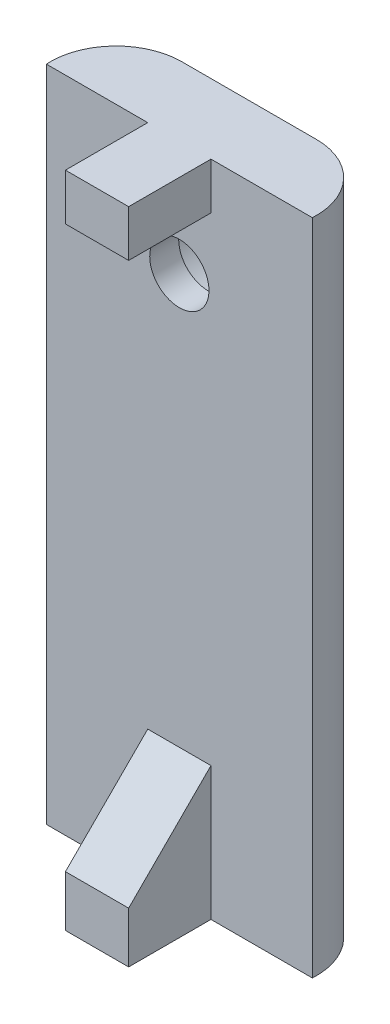
ISO-10303-21;
HEADER;
FILE_DESCRIPTION(('STEP AP214'),'2;1');
FILE_NAME('part.step','',(''),(''),'','','');
FILE_SCHEMA(('AUTOMOTIVE_DESIGN { 1 0 10303 214 1 1 1 1 }'));
ENDSEC;
DATA;
#1=APPLICATION_CONTEXT('core data for automotive mechanical design processes');
#2=APPLICATION_PROTOCOL_DEFINITION('international standard','automotive_design',2000,#1);
#3=PRODUCT_CONTEXT('',#1,'mechanical');
#4=PRODUCT('Part','Part','',(#3));
#5=PRODUCT_RELATED_PRODUCT_CATEGORY('part','',(#4));
#6=PRODUCT_DEFINITION_FORMATION('','',#4);
#7=PRODUCT_DEFINITION_CONTEXT('part definition',#1,'design');
#8=PRODUCT_DEFINITION('design','',#6,#7);
#9=PRODUCT_DEFINITION_SHAPE('','',#8);
#10=(LENGTH_UNIT() NAMED_UNIT(*) SI_UNIT(.MILLI.,.METRE.));
#11=(NAMED_UNIT(*) PLANE_ANGLE_UNIT() SI_UNIT($,.RADIAN.));
#12=(NAMED_UNIT(*) SI_UNIT($,.STERADIAN.) SOLID_ANGLE_UNIT());
#13=UNCERTAINTY_MEASURE_WITH_UNIT(LENGTH_MEASURE(1.E-05),#10,'distance_accuracy_value','');
#14=(GEOMETRIC_REPRESENTATION_CONTEXT(3) GLOBAL_UNCERTAINTY_ASSIGNED_CONTEXT((#13)) GLOBAL_UNIT_ASSIGNED_CONTEXT((#10,
#11,#12)) REPRESENTATION_CONTEXT('',''));
#15=CARTESIAN_POINT('',(0.,0.,0.));
#16=DIRECTION('',(0.,0.,1.));
#17=DIRECTION('',(1.,0.,0.));
#18=AXIS2_PLACEMENT_3D('',#15,#16,#17);
#19=CARTESIAN_POINT('',(-15.4,25.,-15.4));
#20=DIRECTION('',(0.,0.,1.));
#21=DIRECTION('',(1.,0.,0.));
#22=AXIS2_PLACEMENT_3D('',#19,#20,#21);
#23=PLANE('',#22);
#24=CARTESIAN_POINT('',(0.,16.2790697674419,-15.4));
#25=DIRECTION('',(0.,0.,-1.));
#26=DIRECTION('',(-1.,0.,0.));
#27=AXIS2_PLACEMENT_3D('',#24,#25,#26);
#28=CIRCLE('',#27,4.49999999999999);
#29=CARTESIAN_POINT('',(-4.49999999999999,16.2790697674419,-15.4));
#30=VERTEX_POINT('',#29);
#31=EDGE_CURVE('E612',#30,#30,#28,.T.);
#32=ORIENTED_EDGE('',*,*,#31,.F.);
#33=EDGE_LOOP('',(#32));
#34=FACE_BOUND('',#33,.T.);
#35=DIRECTION('',(-1.,0.,0.));
#36=VECTOR('',#35,1.);
#37=CARTESIAN_POINT('',(-15.4,25.,-15.4));
#38=LINE('',#37,#36);
#39=CARTESIAN_POINT('',(5.10900811461289,25.,-15.4));
#40=VERTEX_POINT('',#39);
#41=CARTESIAN_POINT('',(-5.10900811461289,25.,-15.4));
#42=VERTEX_POINT('',#41);
#43=EDGE_CURVE('E222',#40,#42,#38,.T.);
#44=ORIENTED_EDGE('',*,*,#43,.F.);
#45=DIRECTION('',(0.,-1.,0.));
#46=VECTOR('',#45,1.);
#47=CARTESIAN_POINT('',(5.10900811461289,25.,-15.4));
#48=LINE('',#47,#46);
#49=CARTESIAN_POINT('',(5.10900811461289,10.5,-15.4));
#50=VERTEX_POINT('',#49);
#51=EDGE_CURVE('E281',#40,#50,#48,.T.);
#52=ORIENTED_EDGE('',*,*,#51,.T.);
#53=DIRECTION('',(1.,0.,0.));
#54=VECTOR('',#53,1.);
#55=CARTESIAN_POINT('',(7.8,10.5,-15.4));
#56=LINE('',#55,#54);
#57=CARTESIAN_POINT('',(-5.10900811461289,10.5,-15.4));
#58=VERTEX_POINT('',#57);
#59=EDGE_CURVE('E185',#58,#50,#56,.T.);
#60=ORIENTED_EDGE('',*,*,#59,.F.);
#61=DIRECTION('',(0.,1.,0.));
#62=VECTOR('',#61,1.);
#63=CARTESIAN_POINT('',(-5.10900811461289,25.,-15.4));
#64=LINE('',#63,#62);
#65=EDGE_CURVE('E275',#58,#42,#64,.T.);
#66=ORIENTED_EDGE('',*,*,#65,.T.);
#67=EDGE_LOOP('',(#44,#52,#60,#66));
#68=FACE_BOUND('',#67,.T.);
#69=ADVANCED_FACE('F34',(#34,#68),#23,.F.);
#70=DIRECTION('',(-1.,0.,0.));
#71=VECTOR('',#70,1.);
#72=CARTESIAN_POINT('',(7.8,-10.5,-15.4));
#73=LINE('',#72,#71);
#74=CARTESIAN_POINT('',(5.10900811461289,-10.5,-15.4));
#75=VERTEX_POINT('',#74);
#76=CARTESIAN_POINT('',(-5.10900811461289,-10.5,-15.4));
#77=VERTEX_POINT('',#76);
#78=EDGE_CURVE('E183',#75,#77,#73,.T.);
#79=ORIENTED_EDGE('',*,*,#78,.F.);
#80=DIRECTION('',(0.,-1.,0.));
#81=VECTOR('',#80,1.);
#82=CARTESIAN_POINT('',(5.10900811461289,25.,-15.4));
#83=LINE('',#82,#81);
#84=CARTESIAN_POINT('',(5.10900811461289,-25.,-15.4));
#85=VERTEX_POINT('',#84);
#86=EDGE_CURVE('E279',#75,#85,#83,.T.);
#87=ORIENTED_EDGE('',*,*,#86,.T.);
#88=DIRECTION('',(-1.,0.,0.));
#89=VECTOR('',#88,1.);
#90=CARTESIAN_POINT('',(-15.4,-25.,-15.4));
#91=LINE('',#90,#89);
#92=CARTESIAN_POINT('',(-5.10900811461289,-25.,-15.4));
#93=VERTEX_POINT('',#92);
#94=EDGE_CURVE('E214',#85,#93,#91,.T.);
#95=ORIENTED_EDGE('',*,*,#94,.T.);
#96=DIRECTION('',(0.,1.,0.));
#97=VECTOR('',#96,1.);
#98=CARTESIAN_POINT('',(-5.10900811461289,25.,-15.4));
#99=LINE('',#98,#97);
#100=EDGE_CURVE('E277',#93,#77,#99,.T.);
#101=ORIENTED_EDGE('',*,*,#100,.T.);
#102=EDGE_LOOP('',(#79,#87,#95,#101));
#103=FACE_BOUND('',#102,.T.);
#104=ADVANCED_FACE('F344',(#103),#23,.F.);
#105=CARTESIAN_POINT('',(-2.4,25.,-10.1));
#106=DIRECTION('',(1.,0.,0.));
#107=DIRECTION('',(0.,0.,-1.));
#108=AXIS2_PLACEMENT_3D('',#105,#106,#107);
#109=PLANE('',#108);
#110=DIRECTION('',(0.,-1.,0.));
#111=VECTOR('',#110,1.);
#112=CARTESIAN_POINT('',(-2.4,25.,-3.85));
#113=LINE('',#112,#111);
#114=CARTESIAN_POINT('',(-2.4,-21.1309878751741,-3.85));
#115=VERTEX_POINT('',#114);
#116=CARTESIAN_POINT('',(-2.4,-25.,-3.85));
#117=VERTEX_POINT('',#116);
#118=EDGE_CURVE('E252',#115,#117,#113,.T.);
#119=ORIENTED_EDGE('',*,*,#118,.F.);
#120=DIRECTION('',(0.,-0.707106781186551,0.707106781186544));
#121=VECTOR('',#120,1.);
#122=CARTESIAN_POINT('',(-2.4,-21.1309878751741,-3.85));
#123=LINE('',#122,#121);
#124=CARTESIAN_POINT('',(-2.4,-14.880987875174,-10.1));
#125=VERTEX_POINT('',#124);
#126=EDGE_CURVE('E269',#115,#125,#123,.F.);
#127=ORIENTED_EDGE('',*,*,#126,.T.);
#128=DIRECTION('',(0.,-1.,0.));
#129=VECTOR('',#128,1.);
#130=CARTESIAN_POINT('',(-2.4,25.,-10.1));
#131=LINE('',#130,#129);
#132=CARTESIAN_POINT('',(-2.4,-25.,-10.1));
#133=VERTEX_POINT('',#132);
#134=EDGE_CURVE('E256',#125,#133,#131,.T.);
#135=ORIENTED_EDGE('',*,*,#134,.T.);
#136=DIRECTION('',(0.,0.,1.));
#137=VECTOR('',#136,1.);
#138=CARTESIAN_POINT('',(-2.4,-25.,-10.1));
#139=LINE('',#138,#137);
#140=EDGE_CURVE('E228',#133,#117,#139,.T.);
#141=ORIENTED_EDGE('',*,*,#140,.T.);
#142=EDGE_LOOP('',(#119,#127,#135,#141));
#143=FACE_BOUND('',#142,.T.);
#144=ADVANCED_FACE('F361',(#143),#109,.F.);
#145=CARTESIAN_POINT('',(-2.4,25.,-3.85));
#146=DIRECTION('',(0.,0.,-1.));
#147=DIRECTION('',(-1.,0.,0.));
#148=AXIS2_PLACEMENT_3D('',#145,#146,#147);
#149=PLANE('',#148);
#150=DIRECTION('',(0.,-1.,0.));
#151=VECTOR('',#150,1.);
#152=CARTESIAN_POINT('',(2.4,25.,-3.85));
#153=LINE('',#152,#151);
#154=CARTESIAN_POINT('',(2.4,-21.1309878751741,-3.85));
#155=VERTEX_POINT('',#154);
#156=CARTESIAN_POINT('',(2.4,-25.,-3.85));
#157=VERTEX_POINT('',#156);
#158=EDGE_CURVE('E248',#155,#157,#153,.T.);
#159=ORIENTED_EDGE('',*,*,#158,.F.);
#160=DIRECTION('',(-1.,0.,0.));
#161=VECTOR('',#160,1.);
#162=CARTESIAN_POINT('',(-2.4,-21.1309878751741,-3.85));
#163=LINE('',#162,#161);
#164=EDGE_CURVE('E266',#155,#115,#163,.T.);
#165=ORIENTED_EDGE('',*,*,#164,.T.);
#166=ORIENTED_EDGE('',*,*,#118,.T.);
#167=DIRECTION('',(1.,0.,0.));
#168=VECTOR('',#167,1.);
#169=CARTESIAN_POINT('',(-2.4,-25.,-3.85));
#170=LINE('',#169,#168);
#171=EDGE_CURVE('E231',#117,#157,#170,.T.);
#172=ORIENTED_EDGE('',*,*,#171,.T.);
#173=EDGE_LOOP('',(#159,#165,#166,#172));
#174=FACE_BOUND('',#173,.T.);
#175=ADVANCED_FACE('F359',(#174),#149,.F.);
#176=CARTESIAN_POINT('',(2.4,25.,-10.1));
#177=DIRECTION('',(-1.,0.,0.));
#178=DIRECTION('',(0.,0.,1.));
#179=AXIS2_PLACEMENT_3D('',#176,#177,#178);
#180=PLANE('',#179);
#181=DIRECTION('',(0.,-1.,0.));
#182=VECTOR('',#181,1.);
#183=CARTESIAN_POINT('',(2.4,25.,-10.1));
#184=LINE('',#183,#182);
#185=CARTESIAN_POINT('',(2.4,-14.880987875174,-10.1));
#186=VERTEX_POINT('',#185);
#187=CARTESIAN_POINT('',(2.4,-25.,-10.1));
#188=VERTEX_POINT('',#187);
#189=EDGE_CURVE('E244',#186,#188,#184,.T.);
#190=ORIENTED_EDGE('',*,*,#189,.F.);
#191=DIRECTION('',(0.,0.707106781186551,-0.707106781186544));
#192=VECTOR('',#191,1.);
#193=CARTESIAN_POINT('',(2.4,-21.1309878751741,-3.85));
#194=LINE('',#193,#192);
#195=EDGE_CURVE('E271',#186,#155,#194,.F.);
#196=ORIENTED_EDGE('',*,*,#195,.T.);
#197=ORIENTED_EDGE('',*,*,#158,.T.);
#198=DIRECTION('',(0.,0.,-1.));
#199=VECTOR('',#198,1.);
#200=CARTESIAN_POINT('',(2.4,-25.,-10.1));
#201=LINE('',#200,#199);
#202=EDGE_CURVE('E234',#157,#188,#201,.T.);
#203=ORIENTED_EDGE('',*,*,#202,.T.);
#204=EDGE_LOOP('',(#190,#196,#197,#203));
#205=FACE_BOUND('',#204,.T.);
#206=ADVANCED_FACE('F357',(#205),#180,.F.);
#207=CARTESIAN_POINT('',(-2.4,25.,-10.1));
#208=VERTEX_POINT('',#207);
#209=CARTESIAN_POINT('',(-2.4,21.4617325152062,-10.1));
#210=VERTEX_POINT('',#209);
#211=EDGE_CURVE('E257',#208,#210,#131,.T.);
#212=ORIENTED_EDGE('',*,*,#211,.T.);
#213=DIRECTION('',(0.,0.,1.));
#214=VECTOR('',#213,1.);
#215=CARTESIAN_POINT('',(-2.4,21.4617325152062,-10.1));
#216=LINE('',#215,#214);
#217=CARTESIAN_POINT('',(-2.4,21.4617325152062,-3.85));
#218=VERTEX_POINT('',#217);
#219=EDGE_CURVE('E207',#210,#218,#216,.T.);
#220=ORIENTED_EDGE('',*,*,#219,.T.);
#221=CARTESIAN_POINT('',(-2.4,25.,-3.85));
#222=VERTEX_POINT('',#221);
#223=EDGE_CURVE('E253',#222,#218,#113,.T.);
#224=ORIENTED_EDGE('',*,*,#223,.F.);
#225=DIRECTION('',(0.,0.,1.));
#226=VECTOR('',#225,1.);
#227=CARTESIAN_POINT('',(-2.4,25.,-10.1));
#228=LINE('',#227,#226);
#229=EDGE_CURVE('E213',#208,#222,#228,.T.);
#230=ORIENTED_EDGE('',*,*,#229,.F.);
#231=EDGE_LOOP('',(#212,#220,#224,#230));
#232=FACE_BOUND('',#231,.T.);
#233=ADVANCED_FACE('F324',(#232),#109,.F.);
#234=ORIENTED_EDGE('',*,*,#223,.T.);
#235=DIRECTION('',(1.,0.,0.));
#236=VECTOR('',#235,1.);
#237=CARTESIAN_POINT('',(-2.4,21.4617325152062,-3.85));
#238=LINE('',#237,#236);
#239=CARTESIAN_POINT('',(2.4,21.4617325152062,-3.85));
#240=VERTEX_POINT('',#239);
#241=EDGE_CURVE('E204',#218,#240,#238,.T.);
#242=ORIENTED_EDGE('',*,*,#241,.T.);
#243=CARTESIAN_POINT('',(2.4,25.,-3.85));
#244=VERTEX_POINT('',#243);
#245=EDGE_CURVE('E249',#244,#240,#153,.T.);
#246=ORIENTED_EDGE('',*,*,#245,.F.);
#247=DIRECTION('',(1.,0.,0.));
#248=VECTOR('',#247,1.);
#249=CARTESIAN_POINT('',(-2.4,25.,-3.85));
#250=LINE('',#249,#248);
#251=EDGE_CURVE('E216',#222,#244,#250,.T.);
#252=ORIENTED_EDGE('',*,*,#251,.F.);
#253=EDGE_LOOP('',(#234,#242,#246,#252));
#254=FACE_BOUND('',#253,.T.);
#255=ADVANCED_FACE('F330',(#254),#149,.F.);
#256=ORIENTED_EDGE('',*,*,#245,.T.);
#257=DIRECTION('',(0.,0.,1.));
#258=VECTOR('',#257,1.);
#259=CARTESIAN_POINT('',(2.4,21.4617325152062,-3.47319618366129));
#260=LINE('',#259,#258);
#261=CARTESIAN_POINT('',(2.4,21.4617325152062,-10.1));
#262=VERTEX_POINT('',#261);
#263=EDGE_CURVE('E197',#262,#240,#260,.T.);
#264=ORIENTED_EDGE('',*,*,#263,.F.);
#265=CARTESIAN_POINT('',(2.4,25.,-10.1));
#266=VERTEX_POINT('',#265);
#267=EDGE_CURVE('E245',#266,#262,#184,.T.);
#268=ORIENTED_EDGE('',*,*,#267,.F.);
#269=DIRECTION('',(0.,0.,-1.));
#270=VECTOR('',#269,1.);
#271=CARTESIAN_POINT('',(2.4,25.,-10.1));
#272=LINE('',#271,#270);
#273=EDGE_CURVE('E218',#244,#266,#272,.T.);
#274=ORIENTED_EDGE('',*,*,#273,.F.);
#275=EDGE_LOOP('',(#256,#264,#268,#274));
#276=FACE_BOUND('',#275,.T.);
#277=ADVANCED_FACE('F333',(#276),#180,.F.);
#278=CARTESIAN_POINT('',(10.1,25.,-10.1));
#279=DIRECTION('',(0.,0.,-1.));
#280=DIRECTION('',(-1.,0.,0.));
#281=AXIS2_PLACEMENT_3D('',#278,#279,#280);
#282=PLANE('',#281);
#283=CARTESIAN_POINT('',(0.,16.2790697674419,-10.1));
#284=DIRECTION('',(0.,0.,-1.));
#285=DIRECTION('',(-1.,0.,0.));
#286=AXIS2_PLACEMENT_3D('',#283,#284,#285);
#287=CIRCLE('',#286,2.25);
#288=CARTESIAN_POINT('',(-2.25,16.2790697674419,-10.1));
#289=VERTEX_POINT('',#288);
#290=EDGE_CURVE('E619',#289,#289,#287,.T.);
#291=ORIENTED_EDGE('',*,*,#290,.T.);
#292=EDGE_LOOP('',(#291));
#293=FACE_BOUND('',#292,.T.);
#294=DIRECTION('',(1.,0.,0.));
#295=VECTOR('',#294,1.);
#296=CARTESIAN_POINT('',(-2.6,21.4617325152062,-10.1));
#297=LINE('',#296,#295);
#298=EDGE_CURVE('E202',#210,#262,#297,.T.);
#299=ORIENTED_EDGE('',*,*,#298,.F.);
#300=ORIENTED_EDGE('',*,*,#211,.F.);
#301=DIRECTION('',(1.,0.,0.));
#302=VECTOR('',#301,1.);
#303=CARTESIAN_POINT('',(-10.1,25.,-10.1));
#304=LINE('',#303,#302);
#305=CARTESIAN_POINT('',(-10.1,25.,-10.1));
#306=VERTEX_POINT('',#305);
#307=EDGE_CURVE('E211',#306,#208,#304,.T.);
#308=ORIENTED_EDGE('',*,*,#307,.F.);
#309=DIRECTION('',(0.,-1.,0.));
#310=VECTOR('',#309,1.);
#311=CARTESIAN_POINT('',(-10.1,25.,-10.1));
#312=LINE('',#311,#310);
#313=CARTESIAN_POINT('',(-10.1,-25.,-10.1));
#314=VERTEX_POINT('',#313);
#315=EDGE_CURVE('E260',#306,#314,#312,.T.);
#316=ORIENTED_EDGE('',*,*,#315,.T.);
#317=DIRECTION('',(1.,0.,0.));
#318=VECTOR('',#317,1.);
#319=CARTESIAN_POINT('',(-10.1,-25.,-10.1));
#320=LINE('',#319,#318);
#321=EDGE_CURVE('E210',#314,#133,#320,.T.);
#322=ORIENTED_EDGE('',*,*,#321,.T.);
#323=ORIENTED_EDGE('',*,*,#134,.F.);
#324=DIRECTION('',(-1.,0.,0.));
#325=VECTOR('',#324,1.);
#326=CARTESIAN_POINT('',(10.1,-14.880987875174,-10.1));
#327=LINE('',#326,#325);
#328=EDGE_CURVE('E273',#125,#186,#327,.F.);
#329=ORIENTED_EDGE('',*,*,#328,.T.);
#330=ORIENTED_EDGE('',*,*,#189,.T.);
#331=DIRECTION('',(1.,0.,0.));
#332=VECTOR('',#331,1.);
#333=CARTESIAN_POINT('',(10.1,-25.,-10.1));
#334=LINE('',#333,#332);
#335=CARTESIAN_POINT('',(10.1,-25.,-10.1));
#336=VERTEX_POINT('',#335);
#337=EDGE_CURVE('E237',#188,#336,#334,.T.);
#338=ORIENTED_EDGE('',*,*,#337,.T.);
#339=DIRECTION('',(0.,-1.,0.));
#340=VECTOR('',#339,1.);
#341=CARTESIAN_POINT('',(10.1,25.,-10.1));
#342=LINE('',#341,#340);
#343=CARTESIAN_POINT('',(10.1,25.,-10.1));
#344=VERTEX_POINT('',#343);
#345=EDGE_CURVE('E225',#344,#336,#342,.T.);
#346=ORIENTED_EDGE('',*,*,#345,.F.);
#347=DIRECTION('',(1.,0.,0.));
#348=VECTOR('',#347,1.);
#349=CARTESIAN_POINT('',(10.1,25.,-10.1));
#350=LINE('',#349,#348);
#351=EDGE_CURVE('E220',#266,#344,#350,.T.);
#352=ORIENTED_EDGE('',*,*,#351,.F.);
#353=ORIENTED_EDGE('',*,*,#267,.T.);
#354=EDGE_LOOP('',(#299,#300,#308,#316,#322,#323,#329,#330,#338,#346,#352,#353));
#355=FACE_BOUND('',#354,.T.);
#356=ADVANCED_FACE('F320',(#293,#355),#282,.F.);
#357=CARTESIAN_POINT('',(0.,25.,0.));
#358=DIRECTION('',(0.,-1.,0.));
#359=DIRECTION('',(0.,0.,-1.));
#360=AXIS2_PLACEMENT_3D('',#357,#358,#359);
#361=PLANE('',#360);
#362=ORIENTED_EDGE('',*,*,#351,.T.);
#363=CARTESIAN_POINT('',(5.10900811461289,25.,-10.4));
#364=DIRECTION('',(0.,-1.,0.));
#365=DIRECTION('',(0.,0.,-1.));
#366=AXIS2_PLACEMENT_3D('',#363,#364,#365);
#367=CIRCLE('',#366,5.);
#368=EDGE_CURVE('E42',#344,#40,#367,.F.);
#369=ORIENTED_EDGE('',*,*,#368,.T.);
#370=ORIENTED_EDGE('',*,*,#43,.T.);
#371=CARTESIAN_POINT('',(-5.10900811461289,25.,-10.4));
#372=DIRECTION('',(0.,-1.,0.));
#373=DIRECTION('',(0.,0.,-1.));
#374=AXIS2_PLACEMENT_3D('',#371,#372,#373);
#375=CIRCLE('',#374,5.);
#376=EDGE_CURVE('E296',#42,#306,#375,.F.);
#377=ORIENTED_EDGE('',*,*,#376,.T.);
#378=ORIENTED_EDGE('',*,*,#307,.T.);
#379=ORIENTED_EDGE('',*,*,#229,.T.);
#380=ORIENTED_EDGE('',*,*,#251,.T.);
#381=ORIENTED_EDGE('',*,*,#273,.T.);
#382=EDGE_LOOP('',(#362,#369,#370,#377,#378,#379,#380,#381));
#383=FACE_BOUND('',#382,.T.);
#384=ADVANCED_FACE('F300',(#383),#361,.F.);
#385=CARTESIAN_POINT('',(0.,-25.,0.));
#386=DIRECTION('',(0.,-1.,0.));
#387=DIRECTION('',(0.,0.,-1.));
#388=AXIS2_PLACEMENT_3D('',#385,#386,#387);
#389=PLANE('',#388);
#390=ORIENTED_EDGE('',*,*,#94,.F.);
#391=CARTESIAN_POINT('',(5.10900811461289,-25.,-10.4));
#392=DIRECTION('',(0.,-1.,0.));
#393=DIRECTION('',(0.,0.,-1.));
#394=AXIS2_PLACEMENT_3D('',#391,#392,#393);
#395=CIRCLE('',#394,5.);
#396=EDGE_CURVE('E294',#85,#336,#395,.T.);
#397=ORIENTED_EDGE('',*,*,#396,.T.);
#398=ORIENTED_EDGE('',*,*,#337,.F.);
#399=ORIENTED_EDGE('',*,*,#202,.F.);
#400=ORIENTED_EDGE('',*,*,#171,.F.);
#401=ORIENTED_EDGE('',*,*,#140,.F.);
#402=ORIENTED_EDGE('',*,*,#321,.F.);
#403=CARTESIAN_POINT('',(-5.10900811461289,-25.,-10.4));
#404=DIRECTION('',(0.,-1.,0.));
#405=DIRECTION('',(0.,0.,-1.));
#406=AXIS2_PLACEMENT_3D('',#403,#404,#405);
#407=CIRCLE('',#406,5.);
#408=EDGE_CURVE('E292',#314,#93,#407,.T.);
#409=ORIENTED_EDGE('',*,*,#408,.T.);
#410=EDGE_LOOP('',(#390,#397,#398,#399,#400,#401,#402,#409));
#411=FACE_BOUND('',#410,.T.);
#412=ADVANCED_FACE('F339',(#411),#389,.T.);
#413=CARTESIAN_POINT('',(-2.6,21.4617325152062,-3.47319618366129));
#414=DIRECTION('',(0.,1.,0.));
#415=DIRECTION('',(0.,0.,1.));
#416=AXIS2_PLACEMENT_3D('',#413,#414,#415);
#417=PLANE('',#416);
#418=ORIENTED_EDGE('',*,*,#298,.T.);
#419=ORIENTED_EDGE('',*,*,#263,.T.);
#420=ORIENTED_EDGE('',*,*,#241,.F.);
#421=ORIENTED_EDGE('',*,*,#219,.F.);
#422=EDGE_LOOP('',(#418,#419,#420,#421));
#423=FACE_BOUND('',#422,.T.);
#424=ADVANCED_FACE('F411',(#423),#417,.F.);
#425=CARTESIAN_POINT('',(-7.8,10.5,-12.4));
#426=DIRECTION('',(-1.,0.,0.));
#427=DIRECTION('',(0.,-1.,0.));
#428=AXIS2_PLACEMENT_3D('',#425,#426,#427);
#429=PLANE('',#428);
#430=DIRECTION('',(0.,0.,-1.));
#431=VECTOR('',#430,1.);
#432=CARTESIAN_POINT('',(-7.8,-10.5,-12.4));
#433=LINE('',#432,#431);
#434=CARTESIAN_POINT('',(-7.8,-10.5,-12.4));
#435=VERTEX_POINT('',#434);
#436=CARTESIAN_POINT('',(-7.8,-10.5,-14.6140909663628));
#437=VERTEX_POINT('',#436);
#438=EDGE_CURVE('E195',#435,#437,#433,.T.);
#439=ORIENTED_EDGE('',*,*,#438,.T.);
#440=DIRECTION('',(0.,1.,0.));
#441=VECTOR('',#440,1.);
#442=CARTESIAN_POINT('',(-7.8,-10.5,-14.6140909663628));
#443=LINE('',#442,#441);
#444=CARTESIAN_POINT('',(-7.8,10.5,-14.6140909663628));
#445=VERTEX_POINT('',#444);
#446=EDGE_CURVE('E11',#437,#445,#443,.T.);
#447=ORIENTED_EDGE('',*,*,#446,.T.);
#448=DIRECTION('',(0.,0.,-1.));
#449=VECTOR('',#448,1.);
#450=CARTESIAN_POINT('',(-7.8,10.5,-12.4));
#451=LINE('',#450,#449);
#452=CARTESIAN_POINT('',(-7.8,10.5,-12.4));
#453=VERTEX_POINT('',#452);
#454=EDGE_CURVE('E160',#453,#445,#451,.T.);
#455=ORIENTED_EDGE('',*,*,#454,.F.);
#456=DIRECTION('',(0.,1.,0.));
#457=VECTOR('',#456,1.);
#458=CARTESIAN_POINT('',(-7.8,10.5,-12.4));
#459=LINE('',#458,#457);
#460=EDGE_CURVE('E164',#435,#453,#459,.T.);
#461=ORIENTED_EDGE('',*,*,#460,.F.);
#462=EDGE_LOOP('',(#439,#447,#455,#461));
#463=FACE_BOUND('',#462,.T.);
#464=ADVANCED_FACE('F162',(#463),#429,.F.);
#465=CARTESIAN_POINT('',(7.8,-10.5,-12.4));
#466=DIRECTION('',(0.,-1.,0.));
#467=DIRECTION('',(1.,0.,0.));
#468=AXIS2_PLACEMENT_3D('',#465,#466,#467);
#469=PLANE('',#468);
#470=DIRECTION('',(0.,0.,-1.));
#471=VECTOR('',#470,1.);
#472=CARTESIAN_POINT('',(7.8,-10.5,-12.4));
#473=LINE('',#472,#471);
#474=CARTESIAN_POINT('',(7.8,-10.5,-12.4));
#475=VERTEX_POINT('',#474);
#476=CARTESIAN_POINT('',(7.8,-10.5,-14.6140909663628));
#477=VERTEX_POINT('',#476);
#478=EDGE_CURVE('E198',#475,#477,#473,.T.);
#479=ORIENTED_EDGE('',*,*,#478,.T.);
#480=CARTESIAN_POINT('',(5.10900811461289,-10.5,-10.4));
#481=DIRECTION('',(0.,-1.,0.));
#482=DIRECTION('',(1.,0.,0.));
#483=AXIS2_PLACEMENT_3D('',#480,#481,#482);
#484=CIRCLE('',#483,5.);
#485=EDGE_CURVE('E290',#477,#75,#484,.F.);
#486=ORIENTED_EDGE('',*,*,#485,.T.);
#487=ORIENTED_EDGE('',*,*,#78,.T.);
#488=CARTESIAN_POINT('',(-5.10900811461289,-10.5,-10.4));
#489=DIRECTION('',(0.,-1.,0.));
#490=DIRECTION('',(1.,0.,0.));
#491=AXIS2_PLACEMENT_3D('',#488,#489,#490);
#492=CIRCLE('',#491,5.);
#493=EDGE_CURVE('E49',#77,#437,#492,.F.);
#494=ORIENTED_EDGE('',*,*,#493,.T.);
#495=ORIENTED_EDGE('',*,*,#438,.F.);
#496=DIRECTION('',(-1.,0.,0.));
#497=VECTOR('',#496,1.);
#498=CARTESIAN_POINT('',(7.8,-10.5,-12.4));
#499=LINE('',#498,#497);
#500=EDGE_CURVE('E170',#475,#435,#499,.T.);
#501=ORIENTED_EDGE('',*,*,#500,.F.);
#502=EDGE_LOOP('',(#479,#486,#487,#494,#495,#501));
#503=FACE_BOUND('',#502,.T.);
#504=ADVANCED_FACE('F312',(#503),#469,.F.);
#505=CARTESIAN_POINT('',(7.8,10.5,-12.4));
#506=DIRECTION('',(1.,0.,0.));
#507=DIRECTION('',(0.,1.,0.));
#508=AXIS2_PLACEMENT_3D('',#505,#506,#507);
#509=PLANE('',#508);
#510=DIRECTION('',(0.,0.,-1.));
#511=VECTOR('',#510,1.);
#512=CARTESIAN_POINT('',(7.8,10.5,-12.4));
#513=LINE('',#512,#511);
#514=CARTESIAN_POINT('',(7.8,10.5,-12.4));
#515=VERTEX_POINT('',#514);
#516=CARTESIAN_POINT('',(7.8,10.5,-14.6140909663628));
#517=VERTEX_POINT('',#516);
#518=EDGE_CURVE('E169',#515,#517,#513,.T.);
#519=ORIENTED_EDGE('',*,*,#518,.T.);
#520=DIRECTION('',(0.,-1.,0.));
#521=VECTOR('',#520,1.);
#522=CARTESIAN_POINT('',(7.8,10.5,-14.6140909663628));
#523=LINE('',#522,#521);
#524=EDGE_CURVE('E57',#517,#477,#523,.T.);
#525=ORIENTED_EDGE('',*,*,#524,.T.);
#526=ORIENTED_EDGE('',*,*,#478,.F.);
#527=DIRECTION('',(0.,-1.,0.));
#528=VECTOR('',#527,1.);
#529=CARTESIAN_POINT('',(7.8,10.5,-12.4));
#530=LINE('',#529,#528);
#531=EDGE_CURVE('E179',#515,#475,#530,.T.);
#532=ORIENTED_EDGE('',*,*,#531,.F.);
#533=EDGE_LOOP('',(#519,#525,#526,#532));
#534=FACE_BOUND('',#533,.T.);
#535=ADVANCED_FACE('F311',(#534),#509,.F.);
#536=CARTESIAN_POINT('',(7.8,10.5,-12.4));
#537=DIRECTION('',(0.,1.,0.));
#538=DIRECTION('',(0.,0.,1.));
#539=AXIS2_PLACEMENT_3D('',#536,#537,#538);
#540=PLANE('',#539);
#541=ORIENTED_EDGE('',*,*,#59,.T.);
#542=CARTESIAN_POINT('',(5.10900811461289,10.5,-10.4));
#543=DIRECTION('',(0.,1.,0.));
#544=DIRECTION('',(0.,0.,1.));
#545=AXIS2_PLACEMENT_3D('',#542,#543,#544);
#546=CIRCLE('',#545,5.);
#547=EDGE_CURVE('E286',#50,#517,#546,.F.);
#548=ORIENTED_EDGE('',*,*,#547,.T.);
#549=ORIENTED_EDGE('',*,*,#518,.F.);
#550=DIRECTION('',(1.,0.,0.));
#551=VECTOR('',#550,1.);
#552=CARTESIAN_POINT('',(7.8,10.5,-12.4));
#553=LINE('',#552,#551);
#554=EDGE_CURVE('E173',#453,#515,#553,.T.);
#555=ORIENTED_EDGE('',*,*,#554,.F.);
#556=ORIENTED_EDGE('',*,*,#454,.T.);
#557=CARTESIAN_POINT('',(-5.10900811461289,10.5,-10.4));
#558=DIRECTION('',(0.,1.,0.));
#559=DIRECTION('',(0.,0.,1.));
#560=AXIS2_PLACEMENT_3D('',#557,#558,#559);
#561=CIRCLE('',#560,5.);
#562=EDGE_CURVE('E284',#445,#58,#561,.F.);
#563=ORIENTED_EDGE('',*,*,#562,.T.);
#564=EDGE_LOOP('',(#541,#548,#549,#555,#556,#563));
#565=FACE_BOUND('',#564,.T.);
#566=ADVANCED_FACE('F175',(#565),#540,.F.);
#567=CARTESIAN_POINT('',(0.,0.,-12.4));
#568=DIRECTION('',(0.,0.,-1.));
#569=DIRECTION('',(-1.,0.,0.));
#570=AXIS2_PLACEMENT_3D('',#567,#568,#569);
#571=PLANE('',#570);
#572=CARTESIAN_POINT('',(-4.82176305006965,7.4,-12.4));
#573=DIRECTION('',(0.,0.,-1.));
#574=DIRECTION('',(-1.,0.,0.));
#575=AXIS2_PLACEMENT_3D('',#572,#573,#574);
#576=CIRCLE('',#575,2.);
#577=CARTESIAN_POINT('',(-6.82176305006965,7.4,-12.4));
#578=VERTEX_POINT('',#577);
#579=EDGE_CURVE('E263',#578,#578,#576,.T.);
#580=ORIENTED_EDGE('',*,*,#579,.F.);
#581=EDGE_LOOP('',(#580));
#582=FACE_BOUND('',#581,.T.);
#583=CARTESIAN_POINT('',(-4.82176305006965,-7.4,-12.4));
#584=DIRECTION('',(0.,0.,1.));
#585=DIRECTION('',(1.,0.,0.));
#586=AXIS2_PLACEMENT_3D('',#583,#584,#585);
#587=CIRCLE('',#586,2.);
#588=CARTESIAN_POINT('',(-2.82176305006965,-7.4,-12.4));
#589=VERTEX_POINT('',#588);
#590=EDGE_CURVE('E193',#589,#589,#587,.T.);
#591=ORIENTED_EDGE('',*,*,#590,.T.);
#592=EDGE_LOOP('',(#591));
#593=FACE_BOUND('',#592,.T.);
#594=ORIENTED_EDGE('',*,*,#460,.T.);
#595=ORIENTED_EDGE('',*,*,#554,.T.);
#596=ORIENTED_EDGE('',*,*,#531,.T.);
#597=ORIENTED_EDGE('',*,*,#500,.T.);
#598=EDGE_LOOP('',(#594,#595,#596,#597));
#599=FACE_BOUND('',#598,.T.);
#600=ADVANCED_FACE('F181',(#582,#593,#599),#571,.T.);
#601=CARTESIAN_POINT('',(-4.82176305006965,-7.4,-12.4));
#602=DIRECTION('',(0.,0.,-1.));
#603=DIRECTION('',(-1.,0.,0.));
#604=AXIS2_PLACEMENT_3D('',#601,#602,#603);
#605=CYLINDRICAL_SURFACE('',#604,2.);
#606=ORIENTED_EDGE('',*,*,#590,.F.);
#607=EDGE_LOOP('',(#606));
#608=FACE_BOUND('',#607,.T.);
#609=CARTESIAN_POINT('',(-4.82176305006965,-7.4,-15.4));
#610=DIRECTION('',(0.,0.,1.));
#611=DIRECTION('',(1.,0.,0.));
#612=AXIS2_PLACEMENT_3D('',#609,#610,#611);
#613=CIRCLE('',#612,2.);
#614=CARTESIAN_POINT('',(-2.82176305006965,-7.4,-15.4));
#615=VERTEX_POINT('',#614);
#616=EDGE_CURVE('E188',#615,#615,#613,.T.);
#617=ORIENTED_EDGE('',*,*,#616,.T.);
#618=EDGE_LOOP('',(#617));
#619=FACE_BOUND('',#618,.T.);
#620=ADVANCED_FACE('F448',(#608,#619),#605,.T.);
#621=CARTESIAN_POINT('',(-4.82176305006965,-7.4,-15.4));
#622=DIRECTION('',(0.,0.,1.));
#623=DIRECTION('',(1.,0.,0.));
#624=AXIS2_PLACEMENT_3D('',#621,#622,#623);
#625=PLANE('',#624);
#626=ORIENTED_EDGE('',*,*,#616,.F.);
#627=EDGE_LOOP('',(#626));
#628=FACE_BOUND('',#627,.T.);
#629=ADVANCED_FACE('F456',(#628),#625,.F.);
#630=CARTESIAN_POINT('',(-4.82176305006965,7.4,-12.4));
#631=DIRECTION('',(0.,0.,-1.));
#632=DIRECTION('',(-1.,0.,0.));
#633=AXIS2_PLACEMENT_3D('',#630,#631,#632);
#634=CYLINDRICAL_SURFACE('',#633,2.);
#635=ORIENTED_EDGE('',*,*,#579,.T.);
#636=EDGE_LOOP('',(#635));
#637=FACE_BOUND('',#636,.T.);
#638=CARTESIAN_POINT('',(-4.82176305006965,7.4,-15.4));
#639=DIRECTION('',(0.,0.,-1.));
#640=DIRECTION('',(-1.,0.,0.));
#641=AXIS2_PLACEMENT_3D('',#638,#639,#640);
#642=CIRCLE('',#641,2.);
#643=CARTESIAN_POINT('',(-6.82176305006965,7.4,-15.4));
#644=VERTEX_POINT('',#643);
#645=EDGE_CURVE('E622',#644,#644,#642,.T.);
#646=ORIENTED_EDGE('',*,*,#645,.F.);
#647=EDGE_LOOP('',(#646));
#648=FACE_BOUND('',#647,.T.);
#649=ADVANCED_FACE('F464',(#637,#648),#634,.T.);
#650=CARTESIAN_POINT('',(-4.82176305006965,7.4,-15.4));
#651=DIRECTION('',(0.,0.,-1.));
#652=DIRECTION('',(-1.,0.,0.));
#653=AXIS2_PLACEMENT_3D('',#650,#651,#652);
#654=PLANE('',#653);
#655=ORIENTED_EDGE('',*,*,#645,.T.);
#656=EDGE_LOOP('',(#655));
#657=FACE_BOUND('',#656,.T.);
#658=ADVANCED_FACE('F472',(#657),#654,.T.);
#659=CARTESIAN_POINT('',(0.,16.2790697674419,-15.4));
#660=DIRECTION('',(0.,0.,-1.));
#661=DIRECTION('',(-1.,0.,0.));
#662=AXIS2_PLACEMENT_3D('',#659,#660,#661);
#663=CYLINDRICAL_SURFACE('',#662,2.25);
#664=ORIENTED_EDGE('',*,*,#290,.F.);
#665=EDGE_LOOP('',(#664));
#666=FACE_BOUND('',#665,.T.);
#667=CARTESIAN_POINT('',(0.,16.2790697674419,-12.3));
#668=DIRECTION('',(0.,0.,-1.));
#669=DIRECTION('',(-1.,0.,0.));
#670=AXIS2_PLACEMENT_3D('',#667,#668,#669);
#671=CIRCLE('',#670,2.25);
#672=CARTESIAN_POINT('',(-2.25,16.2790697674419,-12.3));
#673=VERTEX_POINT('',#672);
#674=EDGE_CURVE('E614',#673,#673,#671,.T.);
#675=ORIENTED_EDGE('',*,*,#674,.T.);
#676=EDGE_LOOP('',(#675));
#677=FACE_BOUND('',#676,.T.);
#678=ADVANCED_FACE('F480',(#666,#677),#663,.F.);
#679=CARTESIAN_POINT('',(2.25,16.2790697674419,-12.3));
#680=DIRECTION('',(0.,0.,1.));
#681=DIRECTION('',(1.,0.,0.));
#682=AXIS2_PLACEMENT_3D('',#679,#680,#681);
#683=PLANE('',#682);
#684=ORIENTED_EDGE('',*,*,#674,.F.);
#685=EDGE_LOOP('',(#684));
#686=FACE_BOUND('',#685,.T.);
#687=CARTESIAN_POINT('',(0.,16.2790697674419,-12.3));
#688=DIRECTION('',(0.,0.,-1.));
#689=DIRECTION('',(-1.,0.,0.));
#690=AXIS2_PLACEMENT_3D('',#687,#688,#689);
#691=CIRCLE('',#690,4.5);
#692=CARTESIAN_POINT('',(-4.5,16.2790697674419,-12.3));
#693=VERTEX_POINT('',#692);
#694=EDGE_CURVE('E610',#693,#693,#691,.T.);
#695=ORIENTED_EDGE('',*,*,#694,.T.);
#696=EDGE_LOOP('',(#695));
#697=FACE_BOUND('',#696,.T.);
#698=ADVANCED_FACE('F488',(#686,#697),#683,.F.);
#699=CARTESIAN_POINT('',(0.,16.2790697674419,-15.4));
#700=DIRECTION('',(0.,0.,-1.));
#701=DIRECTION('',(-1.,0.,0.));
#702=AXIS2_PLACEMENT_3D('',#699,#700,#701);
#703=CYLINDRICAL_SURFACE('',#702,4.5);
#704=ORIENTED_EDGE('',*,*,#694,.F.);
#705=EDGE_LOOP('',(#704));
#706=FACE_BOUND('',#705,.T.);
#707=ORIENTED_EDGE('',*,*,#31,.T.);
#708=EDGE_LOOP('',(#707));
#709=FACE_BOUND('',#708,.T.);
#710=ADVANCED_FACE('F496',(#706,#709),#703,.F.);
#711=CARTESIAN_POINT('',(-2.4,-21.1309878751741,-3.85));
#712=DIRECTION('',(0.,-0.707106781186544,-0.707106781186551));
#713=DIRECTION('',(-1.,0.,0.));
#714=AXIS2_PLACEMENT_3D('',#711,#712,#713);
#715=PLANE('',#714);
#716=ORIENTED_EDGE('',*,*,#195,.F.);
#717=ORIENTED_EDGE('',*,*,#328,.F.);
#718=ORIENTED_EDGE('',*,*,#126,.F.);
#719=ORIENTED_EDGE('',*,*,#164,.F.);
#720=EDGE_LOOP('',(#716,#717,#718,#719));
#721=FACE_BOUND('',#720,.T.);
#722=ADVANCED_FACE('F353',(#721),#715,.F.);
#723=CARTESIAN_POINT('',(5.10900811461289,25.,-10.4));
#724=DIRECTION('',(0.,-1.,0.));
#725=DIRECTION('',(0.,0.,-1.));
#726=AXIS2_PLACEMENT_3D('',#723,#724,#725);
#727=CYLINDRICAL_SURFACE('',#726,5.);
#728=ORIENTED_EDGE('',*,*,#368,.F.);
#729=ORIENTED_EDGE('',*,*,#345,.T.);
#730=ORIENTED_EDGE('',*,*,#396,.F.);
#731=ORIENTED_EDGE('',*,*,#86,.F.);
#732=ORIENTED_EDGE('',*,*,#485,.F.);
#733=ORIENTED_EDGE('',*,*,#524,.F.);
#734=ORIENTED_EDGE('',*,*,#547,.F.);
#735=ORIENTED_EDGE('',*,*,#51,.F.);
#736=EDGE_LOOP('',(#728,#729,#730,#731,#732,#733,#734,#735));
#737=FACE_BOUND('',#736,.T.);
#738=ADVANCED_FACE('F309',(#737),#727,.T.);
#739=CARTESIAN_POINT('',(-5.10900811461289,25.,-10.4));
#740=DIRECTION('',(0.,1.,0.));
#741=DIRECTION('',(0.,0.,1.));
#742=AXIS2_PLACEMENT_3D('',#739,#740,#741);
#743=CYLINDRICAL_SURFACE('',#742,5.);
#744=ORIENTED_EDGE('',*,*,#493,.F.);
#745=ORIENTED_EDGE('',*,*,#100,.F.);
#746=ORIENTED_EDGE('',*,*,#408,.F.);
#747=ORIENTED_EDGE('',*,*,#315,.F.);
#748=ORIENTED_EDGE('',*,*,#376,.F.);
#749=ORIENTED_EDGE('',*,*,#65,.F.);
#750=ORIENTED_EDGE('',*,*,#562,.F.);
#751=ORIENTED_EDGE('',*,*,#446,.F.);
#752=EDGE_LOOP('',(#744,#745,#746,#747,#748,#749,#750,#751));
#753=FACE_BOUND('',#752,.T.);
#754=ADVANCED_FACE('F36',(#753),#743,.T.);
#755=CLOSED_SHELL('',(#69,#104,#144,#175,#206,#233,#255,#277,#356,#384,#412,#424,#464,#504,#535,
#566,#600,#620,#629,#649,#658,#678,#698,#710,#722,#738,#754));
#756=MANIFOLD_SOLID_BREP('B2',#755);
#757=ADVANCED_BREP_SHAPE_REPRESENTATION('',(#18,#756),#14);
#758=SHAPE_DEFINITION_REPRESENTATION(#9,#757);
ENDSEC;
END-ISO-10303-21;
